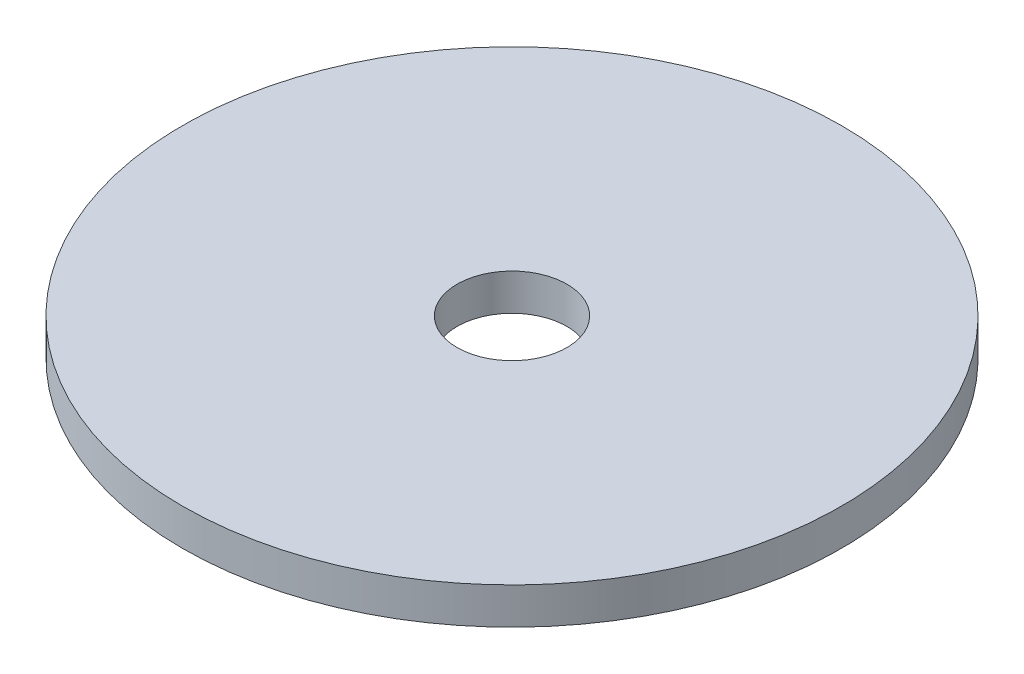
ISO-10303-21;
HEADER;
FILE_DESCRIPTION(('STEP AP214'),'2;1');
FILE_NAME('part.step','',(''),(''),'','','');
FILE_SCHEMA(('AUTOMOTIVE_DESIGN { 1 0 10303 214 1 1 1 1 }'));
ENDSEC;
DATA;
#1=APPLICATION_CONTEXT('core data for automotive mechanical design processes');
#2=APPLICATION_PROTOCOL_DEFINITION('international standard','automotive_design',2000,#1);
#3=PRODUCT_CONTEXT('',#1,'mechanical');
#4=PRODUCT('Part','Part','',(#3));
#5=PRODUCT_RELATED_PRODUCT_CATEGORY('part','',(#4));
#6=PRODUCT_DEFINITION_FORMATION('','',#4);
#7=PRODUCT_DEFINITION_CONTEXT('part definition',#1,'design');
#8=PRODUCT_DEFINITION('design','',#6,#7);
#9=PRODUCT_DEFINITION_SHAPE('','',#8);
#10=(LENGTH_UNIT() NAMED_UNIT(*) SI_UNIT(.MILLI.,.METRE.));
#11=(NAMED_UNIT(*) PLANE_ANGLE_UNIT() SI_UNIT($,.RADIAN.));
#12=(NAMED_UNIT(*) SI_UNIT($,.STERADIAN.) SOLID_ANGLE_UNIT());
#13=UNCERTAINTY_MEASURE_WITH_UNIT(LENGTH_MEASURE(1.E-05),#10,'distance_accuracy_value','');
#14=(GEOMETRIC_REPRESENTATION_CONTEXT(3) GLOBAL_UNCERTAINTY_ASSIGNED_CONTEXT((#13)) GLOBAL_UNIT_ASSIGNED_CONTEXT((#10,
#11,#12)) REPRESENTATION_CONTEXT('',''));
#15=CARTESIAN_POINT('',(0.,0.,0.));
#16=DIRECTION('',(0.,0.,1.));
#17=DIRECTION('',(1.,0.,0.));
#18=AXIS2_PLACEMENT_3D('',#15,#16,#17);
#19=CARTESIAN_POINT('',(0.,4.,0.));
#20=DIRECTION('',(0.,1.,0.));
#21=DIRECTION('',(0.,0.,1.));
#22=AXIS2_PLACEMENT_3D('',#19,#20,#21);
#23=PLANE('',#22);
#24=CARTESIAN_POINT('',(0.,4.,0.));
#25=DIRECTION('',(0.,1.,0.));
#26=DIRECTION('',(0.,0.,1.));
#27=AXIS2_PLACEMENT_3D('',#24,#25,#26);
#28=CIRCLE('',#27,36.);
#29=CARTESIAN_POINT('',(0.,4.,36.));
#30=VERTEX_POINT('',#29);
#31=EDGE_CURVE('E10',#30,#30,#28,.T.);
#32=ORIENTED_EDGE('',*,*,#31,.T.);
#33=EDGE_LOOP('',(#32));
#34=FACE_BOUND('',#33,.T.);
#35=CARTESIAN_POINT('',(0.,4.,0.));
#36=DIRECTION('',(0.,1.,0.));
#37=DIRECTION('',(0.,0.,1.));
#38=AXIS2_PLACEMENT_3D('',#35,#36,#37);
#39=CIRCLE('',#38,6.);
#40=CARTESIAN_POINT('',(0.,4.,6.));
#41=VERTEX_POINT('',#40);
#42=EDGE_CURVE('E40',#41,#41,#39,.T.);
#43=ORIENTED_EDGE('',*,*,#42,.F.);
#44=EDGE_LOOP('',(#43));
#45=FACE_BOUND('',#44,.T.);
#46=ADVANCED_FACE('F29',(#34,#45),#23,.T.);
#47=CARTESIAN_POINT('',(0.,0.,0.));
#48=DIRECTION('',(0.,1.,0.));
#49=DIRECTION('',(0.,0.,1.));
#50=AXIS2_PLACEMENT_3D('',#47,#48,#49);
#51=PLANE('',#50);
#52=CARTESIAN_POINT('',(0.,0.,0.));
#53=DIRECTION('',(0.,1.,0.));
#54=DIRECTION('',(0.,0.,1.));
#55=AXIS2_PLACEMENT_3D('',#52,#53,#54);
#56=CIRCLE('',#55,36.);
#57=CARTESIAN_POINT('',(0.,0.,36.));
#58=VERTEX_POINT('',#57);
#59=EDGE_CURVE('E33',#58,#58,#56,.T.);
#60=ORIENTED_EDGE('',*,*,#59,.F.);
#61=EDGE_LOOP('',(#60));
#62=FACE_BOUND('',#61,.T.);
#63=CARTESIAN_POINT('',(0.,0.,0.));
#64=DIRECTION('',(0.,1.,0.));
#65=DIRECTION('',(0.,0.,1.));
#66=AXIS2_PLACEMENT_3D('',#63,#64,#65);
#67=CIRCLE('',#66,6.);
#68=CARTESIAN_POINT('',(0.,0.,6.));
#69=VERTEX_POINT('',#68);
#70=EDGE_CURVE('E42',#69,#69,#67,.T.);
#71=ORIENTED_EDGE('',*,*,#70,.T.);
#72=EDGE_LOOP('',(#71));
#73=FACE_BOUND('',#72,.T.);
#74=ADVANCED_FACE('F52',(#62,#73),#51,.F.);
#75=CARTESIAN_POINT('',(0.,4.,0.));
#76=DIRECTION('',(0.,-1.,0.));
#77=DIRECTION('',(0.,0.,-1.));
#78=AXIS2_PLACEMENT_3D('',#75,#76,#77);
#79=CYLINDRICAL_SURFACE('',#78,36.);
#80=ORIENTED_EDGE('',*,*,#31,.F.);
#81=EDGE_LOOP('',(#80));
#82=FACE_BOUND('',#81,.T.);
#83=ORIENTED_EDGE('',*,*,#59,.T.);
#84=EDGE_LOOP('',(#83));
#85=FACE_BOUND('',#84,.T.);
#86=ADVANCED_FACE('F31',(#82,#85),#79,.T.);
#87=CARTESIAN_POINT('',(0.,4.,0.));
#88=DIRECTION('',(0.,-1.,0.));
#89=DIRECTION('',(0.,0.,-1.));
#90=AXIS2_PLACEMENT_3D('',#87,#88,#89);
#91=CYLINDRICAL_SURFACE('',#90,6.);
#92=ORIENTED_EDGE('',*,*,#42,.T.);
#93=EDGE_LOOP('',(#92));
#94=FACE_BOUND('',#93,.T.);
#95=ORIENTED_EDGE('',*,*,#70,.F.);
#96=EDGE_LOOP('',(#95));
#97=FACE_BOUND('',#96,.T.);
#98=ADVANCED_FACE('F48',(#94,#97),#91,.F.);
#99=CLOSED_SHELL('',(#46,#74,#86,#98));
#100=MANIFOLD_SOLID_BREP('B2',#99);
#101=ADVANCED_BREP_SHAPE_REPRESENTATION('',(#18,#100),#14);
#102=SHAPE_DEFINITION_REPRESENTATION(#9,#101);
ENDSEC;
END-ISO-10303-21;
